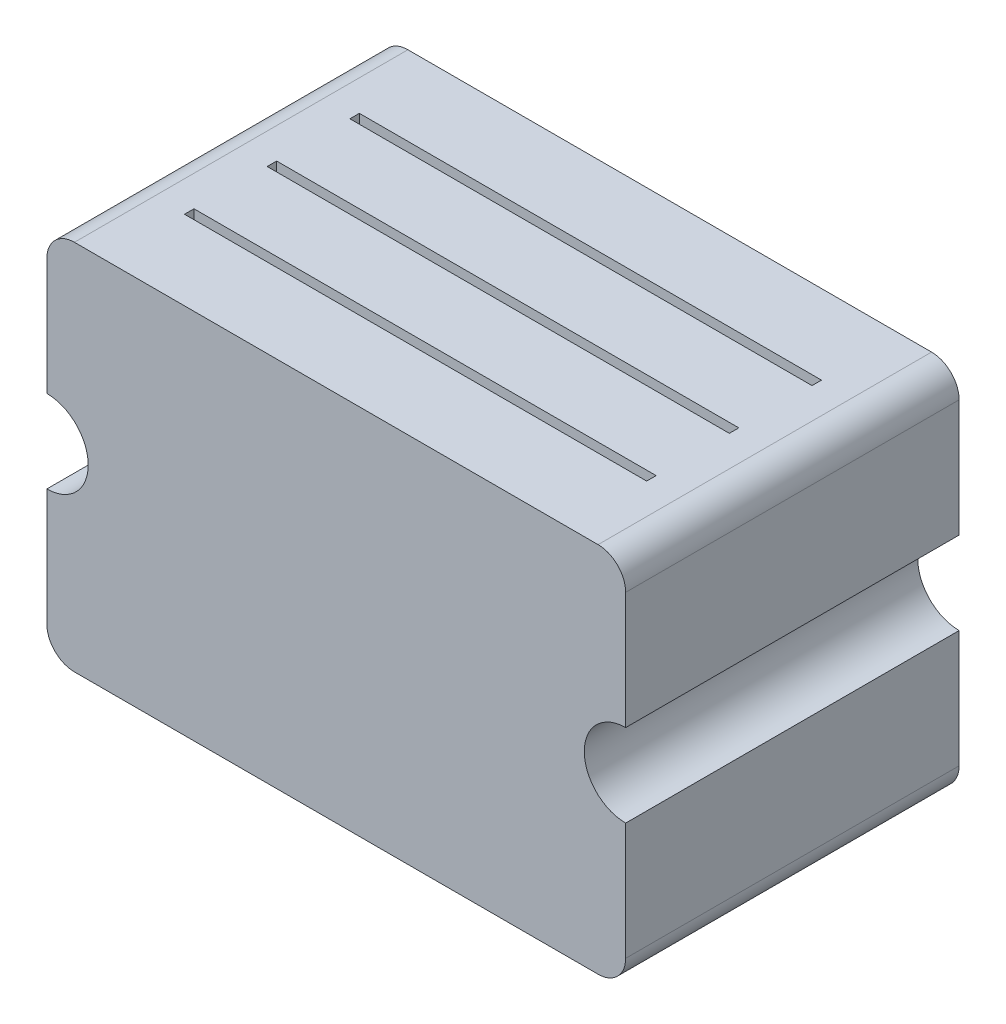
ISO-10303-21;
HEADER;
FILE_DESCRIPTION(('STEP AP214'),'2;1');
FILE_NAME('part.step','',(''),(''),'','','');
FILE_SCHEMA(('AUTOMOTIVE_DESIGN { 1 0 10303 214 1 1 1 1 }'));
ENDSEC;
DATA;
#1=APPLICATION_CONTEXT('core data for automotive mechanical design processes');
#2=APPLICATION_PROTOCOL_DEFINITION('international standard','automotive_design',2000,#1);
#3=PRODUCT_CONTEXT('',#1,'mechanical');
#4=PRODUCT('Part','Part','',(#3));
#5=PRODUCT_RELATED_PRODUCT_CATEGORY('part','',(#4));
#6=PRODUCT_DEFINITION_FORMATION('','',#4);
#7=PRODUCT_DEFINITION_CONTEXT('part definition',#1,'design');
#8=PRODUCT_DEFINITION('design','',#6,#7);
#9=PRODUCT_DEFINITION_SHAPE('','',#8);
#10=(LENGTH_UNIT() NAMED_UNIT(*) SI_UNIT(.MILLI.,.METRE.));
#11=(NAMED_UNIT(*) PLANE_ANGLE_UNIT() SI_UNIT($,.RADIAN.));
#12=(NAMED_UNIT(*) SI_UNIT($,.STERADIAN.) SOLID_ANGLE_UNIT());
#13=UNCERTAINTY_MEASURE_WITH_UNIT(LENGTH_MEASURE(1.E-05),#10,'distance_accuracy_value','');
#14=(GEOMETRIC_REPRESENTATION_CONTEXT(3) GLOBAL_UNCERTAINTY_ASSIGNED_CONTEXT((#13)) GLOBAL_UNIT_ASSIGNED_CONTEXT((#10,
#11,#12)) REPRESENTATION_CONTEXT('',''));
#15=CARTESIAN_POINT('',(0.,0.,0.));
#16=DIRECTION('',(0.,0.,1.));
#17=DIRECTION('',(1.,0.,0.));
#18=AXIS2_PLACEMENT_3D('',#15,#16,#17);
#19=CARTESIAN_POINT('',(-1.05,-0.675,0.));
#20=DIRECTION('',(0.,-1.,0.));
#21=DIRECTION('',(0.,0.,-1.));
#22=AXIS2_PLACEMENT_3D('',#19,#20,#21);
#23=PLANE('',#22);
#24=DIRECTION('',(0.,0.,-1.));
#25=VECTOR('',#24,1.);
#26=CARTESIAN_POINT('',(0.838391795984,-0.675,0.471094755903));
#27=LINE('',#26,#25);
#28=CARTESIAN_POINT('',(0.838391795984,-0.675,0.942189511805));
#29=VERTEX_POINT('',#28);
#30=CARTESIAN_POINT('',(0.838391795984,-0.675,0.907810488195));
#31=VERTEX_POINT('',#30);
#32=EDGE_CURVE('E438',#29,#31,#27,.T.);
#33=ORIENTED_EDGE('',*,*,#32,.T.);
#34=DIRECTION('',(-1.,0.,0.));
#35=VECTOR('',#34,1.);
#36=CARTESIAN_POINT('',(-0.105804102008,-0.675,0.907810488195));
#37=LINE('',#36,#35);
#38=CARTESIAN_POINT('',(-0.838391795984,-0.675,0.907810488195));
#39=VERTEX_POINT('',#38);
#40=EDGE_CURVE('E483',#31,#39,#37,.T.);
#41=ORIENTED_EDGE('',*,*,#40,.T.);
#42=DIRECTION('',(0.,0.,1.));
#43=VECTOR('',#42,1.);
#44=CARTESIAN_POINT('',(-0.838391795984,-0.675,0.453905244097));
#45=LINE('',#44,#43);
#46=CARTESIAN_POINT('',(-0.838391795984,-0.675,0.942189511805));
#47=VERTEX_POINT('',#46);
#48=EDGE_CURVE('E477',#39,#47,#45,.T.);
#49=ORIENTED_EDGE('',*,*,#48,.T.);
#50=DIRECTION('',(1.,0.,0.));
#51=VECTOR('',#50,1.);
#52=CARTESIAN_POINT('',(-0.944195897992,-0.675,0.942189511805));
#53=LINE('',#52,#51);
#54=EDGE_CURVE('E47',#47,#29,#53,.T.);
#55=ORIENTED_EDGE('',*,*,#54,.T.);
#56=EDGE_LOOP('',(#33,#41,#49,#55));
#57=FACE_BOUND('',#56,.T.);
#58=DIRECTION('',(0.,0.,-1.));
#59=VECTOR('',#58,1.);
#60=CARTESIAN_POINT('',(0.838391795984,-0.675,0.321094755903));
#61=LINE('',#60,#59);
#62=CARTESIAN_POINT('',(0.838391795984,-0.675,0.642189511805));
#63=VERTEX_POINT('',#62);
#64=CARTESIAN_POINT('',(0.838391795984,-0.675,0.607810488195));
#65=VERTEX_POINT('',#64);
#66=EDGE_CURVE('E415',#63,#65,#61,.T.);
#67=ORIENTED_EDGE('',*,*,#66,.T.);
#68=DIRECTION('',(-1.,0.,0.));
#69=VECTOR('',#68,1.);
#70=CARTESIAN_POINT('',(-0.105804102008,-0.675,0.607810488195));
#71=LINE('',#70,#69);
#72=CARTESIAN_POINT('',(-0.838391795984,-0.675,0.607810488195));
#73=VERTEX_POINT('',#72);
#74=EDGE_CURVE('E416',#65,#73,#71,.T.);
#75=ORIENTED_EDGE('',*,*,#74,.T.);
#76=DIRECTION('',(0.,0.,1.));
#77=VECTOR('',#76,1.);
#78=CARTESIAN_POINT('',(-0.838391795984,-0.675,0.303905244097));
#79=LINE('',#78,#77);
#80=CARTESIAN_POINT('',(-0.838391795984,-0.675,0.642189511805));
#81=VERTEX_POINT('',#80);
#82=EDGE_CURVE('E369',#73,#81,#79,.T.);
#83=ORIENTED_EDGE('',*,*,#82,.T.);
#84=DIRECTION('',(1.,0.,0.));
#85=VECTOR('',#84,1.);
#86=CARTESIAN_POINT('',(-0.944195897992,-0.675,0.642189511805));
#87=LINE('',#86,#85);
#88=EDGE_CURVE('E470',#81,#63,#87,.T.);
#89=ORIENTED_EDGE('',*,*,#88,.T.);
#90=EDGE_LOOP('',(#67,#75,#83,#89));
#91=FACE_BOUND('',#90,.T.);
#92=DIRECTION('',(0.,0.,-1.));
#93=VECTOR('',#92,1.);
#94=CARTESIAN_POINT('',(0.838391795984,-0.675,0.171094755903));
#95=LINE('',#94,#93);
#96=CARTESIAN_POINT('',(0.838391795984,-0.675,0.342189511805));
#97=VERTEX_POINT('',#96);
#98=CARTESIAN_POINT('',(0.838391795984,-0.675,0.307810488195));
#99=VERTEX_POINT('',#98);
#100=EDGE_CURVE('E273',#97,#99,#95,.T.);
#101=ORIENTED_EDGE('',*,*,#100,.T.);
#102=DIRECTION('',(-1.,0.,0.));
#103=VECTOR('',#102,1.);
#104=CARTESIAN_POINT('',(-0.105804102008,-0.675,0.307810488195));
#105=LINE('',#104,#103);
#106=CARTESIAN_POINT('',(-0.838391795984,-0.675,0.307810488195));
#107=VERTEX_POINT('',#106);
#108=EDGE_CURVE('E337',#99,#107,#105,.T.);
#109=ORIENTED_EDGE('',*,*,#108,.T.);
#110=DIRECTION('',(0.,0.,1.));
#111=VECTOR('',#110,1.);
#112=CARTESIAN_POINT('',(-0.838391795984,-0.675,0.153905244097));
#113=LINE('',#112,#111);
#114=CARTESIAN_POINT('',(-0.838391795984,-0.675,0.342189511805));
#115=VERTEX_POINT('',#114);
#116=EDGE_CURVE('E447',#107,#115,#113,.T.);
#117=ORIENTED_EDGE('',*,*,#116,.T.);
#118=DIRECTION('',(1.,0.,0.));
#119=VECTOR('',#118,1.);
#120=CARTESIAN_POINT('',(-0.944195897992,-0.675,0.342189511805));
#121=LINE('',#120,#119);
#122=EDGE_CURVE('E272',#115,#97,#121,.T.);
#123=ORIENTED_EDGE('',*,*,#122,.T.);
#124=EDGE_LOOP('',(#101,#109,#117,#123));
#125=FACE_BOUND('',#124,.T.);
#126=DIRECTION('',(0.,0.,1.));
#127=VECTOR('',#126,1.);
#128=CARTESIAN_POINT('',(-0.95,-0.675,0.));
#129=LINE('',#128,#127);
#130=CARTESIAN_POINT('',(-0.95,-0.675,0.02));
#131=VERTEX_POINT('',#130);
#132=CARTESIAN_POINT('',(-0.95,-0.675,1.23));
#133=VERTEX_POINT('',#132);
#134=EDGE_CURVE('E399',#131,#133,#129,.T.);
#135=ORIENTED_EDGE('',*,*,#134,.F.);
#136=DIRECTION('',(-1.,0.,0.));
#137=VECTOR('',#136,1.);
#138=CARTESIAN_POINT('',(0.,-0.675,0.02));
#139=LINE('',#138,#137);
#140=CARTESIAN_POINT('',(0.95,-0.675,0.02));
#141=VERTEX_POINT('',#140);
#142=EDGE_CURVE('E11',#141,#131,#139,.T.);
#143=ORIENTED_EDGE('',*,*,#142,.F.);
#144=DIRECTION('',(0.,0.,-1.));
#145=VECTOR('',#144,1.);
#146=CARTESIAN_POINT('',(0.95,-0.675,0.));
#147=LINE('',#146,#145);
#148=CARTESIAN_POINT('',(0.95,-0.675,1.23));
#149=VERTEX_POINT('',#148);
#150=EDGE_CURVE('E365',#149,#141,#147,.T.);
#151=ORIENTED_EDGE('',*,*,#150,.F.);
#152=DIRECTION('',(1.,0.,0.));
#153=VECTOR('',#152,1.);
#154=CARTESIAN_POINT('',(-1.05,-0.675,1.23));
#155=LINE('',#154,#153);
#156=EDGE_CURVE('E360',#133,#149,#155,.T.);
#157=ORIENTED_EDGE('',*,*,#156,.F.);
#158=EDGE_LOOP('',(#135,#143,#151,#157));
#159=FACE_BOUND('',#158,.T.);
#160=ADVANCED_FACE('F17',(#57,#91,#125,#159),#23,.T.);
#161=CARTESIAN_POINT('',(0.,0.,0.02));
#162=DIRECTION('',(0.,0.,1.));
#163=DIRECTION('',(1.,0.,0.));
#164=AXIS2_PLACEMENT_3D('',#161,#162,#163);
#165=PLANE('',#164);
#166=CARTESIAN_POINT('',(-0.95,0.575,0.02));
#167=DIRECTION('',(0.,0.,1.));
#168=DIRECTION('',(-0.707106781186548,0.707106781186548,0.));
#169=AXIS2_PLACEMENT_3D('',#166,#167,#168);
#170=CIRCLE('',#169,0.1);
#171=CARTESIAN_POINT('',(-0.95,0.675,0.02));
#172=VERTEX_POINT('',#171);
#173=CARTESIAN_POINT('',(-1.05,0.575,0.02));
#174=VERTEX_POINT('',#173);
#175=EDGE_CURVE('E250',#172,#174,#170,.T.);
#176=ORIENTED_EDGE('',*,*,#175,.F.);
#177=DIRECTION('',(1.,0.,0.));
#178=VECTOR('',#177,1.);
#179=CARTESIAN_POINT('',(1.05,0.675,0.02));
#180=LINE('',#179,#178);
#181=CARTESIAN_POINT('',(0.95,0.675,0.02));
#182=VERTEX_POINT('',#181);
#183=EDGE_CURVE('E308',#172,#182,#180,.T.);
#184=ORIENTED_EDGE('',*,*,#183,.T.);
#185=CARTESIAN_POINT('',(0.95,0.575,0.02));
#186=DIRECTION('',(0.,0.,1.));
#187=DIRECTION('',(0.707106781186548,0.707106781186548,0.));
#188=AXIS2_PLACEMENT_3D('',#185,#186,#187);
#189=CIRCLE('',#188,0.1);
#190=CARTESIAN_POINT('',(1.05,0.575,0.02));
#191=VERTEX_POINT('',#190);
#192=EDGE_CURVE('E314',#191,#182,#189,.T.);
#193=ORIENTED_EDGE('',*,*,#192,.F.);
#194=DIRECTION('',(0.,-1.,0.));
#195=VECTOR('',#194,1.);
#196=CARTESIAN_POINT('',(1.05,0.,0.02));
#197=LINE('',#196,#195);
#198=CARTESIAN_POINT('',(1.05,0.15,0.02));
#199=VERTEX_POINT('',#198);
#200=EDGE_CURVE('E313',#191,#199,#197,.T.);
#201=ORIENTED_EDGE('',*,*,#200,.T.);
#202=CARTESIAN_POINT('',(1.05,0.,0.02));
#203=DIRECTION('',(0.,0.,1.));
#204=DIRECTION('',(-1.,0.,0.));
#205=AXIS2_PLACEMENT_3D('',#202,#203,#204);
#206=CIRCLE('',#205,0.15);
#207=CARTESIAN_POINT('',(1.05,-0.15,0.02));
#208=VERTEX_POINT('',#207);
#209=EDGE_CURVE('E410',#199,#208,#206,.T.);
#210=ORIENTED_EDGE('',*,*,#209,.T.);
#211=DIRECTION('',(0.,-1.,0.));
#212=VECTOR('',#211,1.);
#213=CARTESIAN_POINT('',(1.05,0.,0.02));
#214=LINE('',#213,#212);
#215=CARTESIAN_POINT('',(1.05,-0.575,0.02));
#216=VERTEX_POINT('',#215);
#217=EDGE_CURVE('E349',#208,#216,#214,.T.);
#218=ORIENTED_EDGE('',*,*,#217,.T.);
#219=CARTESIAN_POINT('',(0.95,-0.575,0.02));
#220=DIRECTION('',(0.,0.,1.));
#221=DIRECTION('',(0.707106781186548,-0.707106781186548,0.));
#222=AXIS2_PLACEMENT_3D('',#219,#220,#221);
#223=CIRCLE('',#222,0.1);
#224=EDGE_CURVE('E361',#141,#216,#223,.T.);
#225=ORIENTED_EDGE('',*,*,#224,.F.);
#226=ORIENTED_EDGE('',*,*,#142,.T.);
#227=CARTESIAN_POINT('',(-0.95,-0.575,0.02));
#228=DIRECTION('',(0.,0.,1.));
#229=DIRECTION('',(-0.707106781186548,-0.707106781186548,0.));
#230=AXIS2_PLACEMENT_3D('',#227,#228,#229);
#231=CIRCLE('',#230,0.1);
#232=CARTESIAN_POINT('',(-1.05,-0.575,0.02));
#233=VERTEX_POINT('',#232);
#234=EDGE_CURVE('E395',#233,#131,#231,.T.);
#235=ORIENTED_EDGE('',*,*,#234,.F.);
#236=DIRECTION('',(0.,1.,0.));
#237=VECTOR('',#236,1.);
#238=CARTESIAN_POINT('',(-1.05,0.675,0.02));
#239=LINE('',#238,#237);
#240=CARTESIAN_POINT('',(-1.05,-0.15,0.02));
#241=VERTEX_POINT('',#240);
#242=EDGE_CURVE('E406',#233,#241,#239,.T.);
#243=ORIENTED_EDGE('',*,*,#242,.T.);
#244=CARTESIAN_POINT('',(-1.05,0.,0.02));
#245=DIRECTION('',(0.,0.,1.));
#246=DIRECTION('',(-1.,0.,0.));
#247=AXIS2_PLACEMENT_3D('',#244,#245,#246);
#248=CIRCLE('',#247,0.15);
#249=CARTESIAN_POINT('',(-1.05,0.15,0.02));
#250=VERTEX_POINT('',#249);
#251=EDGE_CURVE('E409',#241,#250,#248,.T.);
#252=ORIENTED_EDGE('',*,*,#251,.T.);
#253=DIRECTION('',(0.,1.,0.));
#254=VECTOR('',#253,1.);
#255=CARTESIAN_POINT('',(-1.05,0.675,0.02));
#256=LINE('',#255,#254);
#257=EDGE_CURVE('E20',#250,#174,#256,.T.);
#258=ORIENTED_EDGE('',*,*,#257,.T.);
#259=EDGE_LOOP('',(#176,#184,#193,#201,#210,#218,#225,#226,#235,#243,#252,#258));
#260=FACE_BOUND('',#259,.T.);
#261=ADVANCED_FACE('F497',(#260),#165,.F.);
#262=CARTESIAN_POINT('',(-1.05,0.675,0.));
#263=DIRECTION('',(-1.,0.,0.));
#264=DIRECTION('',(0.,0.,1.));
#265=AXIS2_PLACEMENT_3D('',#262,#263,#264);
#266=PLANE('',#265);
#267=DIRECTION('',(0.,0.,1.));
#268=VECTOR('',#267,1.);
#269=CARTESIAN_POINT('',(-1.05,0.575,0.));
#270=LINE('',#269,#268);
#271=CARTESIAN_POINT('',(-1.05,0.575,1.23));
#272=VERTEX_POINT('',#271);
#273=EDGE_CURVE('E232',#174,#272,#270,.T.);
#274=ORIENTED_EDGE('',*,*,#273,.F.);
#275=ORIENTED_EDGE('',*,*,#257,.F.);
#276=DIRECTION('',(0.,0.,1.));
#277=VECTOR('',#276,1.);
#278=CARTESIAN_POINT('',(-1.05,0.15,1.23));
#279=LINE('',#278,#277);
#280=CARTESIAN_POINT('',(-1.05,0.15,1.23));
#281=VERTEX_POINT('',#280);
#282=EDGE_CURVE('E235',#250,#281,#279,.T.);
#283=ORIENTED_EDGE('',*,*,#282,.T.);
#284=DIRECTION('',(0.,-1.,0.));
#285=VECTOR('',#284,1.);
#286=CARTESIAN_POINT('',(-1.05,0.675,1.23));
#287=LINE('',#286,#285);
#288=EDGE_CURVE('E229',#272,#281,#287,.T.);
#289=ORIENTED_EDGE('',*,*,#288,.F.);
#290=EDGE_LOOP('',(#274,#275,#283,#289));
#291=FACE_BOUND('',#290,.T.);
#292=ADVANCED_FACE('F231',(#291),#266,.T.);
#293=CARTESIAN_POINT('',(-1.05,0.,1.23));
#294=DIRECTION('',(0.,0.,1.));
#295=DIRECTION('',(-1.,0.,0.));
#296=AXIS2_PLACEMENT_3D('',#293,#294,#295);
#297=CYLINDRICAL_SURFACE('',#296,0.15);
#298=ORIENTED_EDGE('',*,*,#282,.F.);
#299=ORIENTED_EDGE('',*,*,#251,.F.);
#300=DIRECTION('',(0.,0.,-1.));
#301=VECTOR('',#300,1.);
#302=CARTESIAN_POINT('',(-1.05,-0.15,1.23));
#303=LINE('',#302,#301);
#304=CARTESIAN_POINT('',(-1.05,-0.15,1.23));
#305=VERTEX_POINT('',#304);
#306=EDGE_CURVE('E402',#305,#241,#303,.T.);
#307=ORIENTED_EDGE('',*,*,#306,.F.);
#308=CARTESIAN_POINT('',(-1.05,0.,1.23));
#309=DIRECTION('',(0.,0.,-1.));
#310=DIRECTION('',(-1.,0.,0.));
#311=AXIS2_PLACEMENT_3D('',#308,#309,#310);
#312=CIRCLE('',#311,0.15);
#313=EDGE_CURVE('E241',#281,#305,#312,.T.);
#314=ORIENTED_EDGE('',*,*,#313,.F.);
#315=EDGE_LOOP('',(#298,#299,#307,#314));
#316=FACE_BOUND('',#315,.T.);
#317=ADVANCED_FACE('F595',(#316),#297,.F.);
#318=CARTESIAN_POINT('',(1.05,0.,1.23));
#319=DIRECTION('',(0.,0.,1.));
#320=DIRECTION('',(-1.,0.,0.));
#321=AXIS2_PLACEMENT_3D('',#318,#319,#320);
#322=CYLINDRICAL_SURFACE('',#321,0.15);
#323=DIRECTION('',(0.,0.,-1.));
#324=VECTOR('',#323,1.);
#325=CARTESIAN_POINT('',(1.05,0.15,1.23));
#326=LINE('',#325,#324);
#327=CARTESIAN_POINT('',(1.05,0.15,1.23));
#328=VERTEX_POINT('',#327);
#329=EDGE_CURVE('E309',#328,#199,#326,.T.);
#330=ORIENTED_EDGE('',*,*,#329,.F.);
#331=CARTESIAN_POINT('',(1.05,0.,1.23));
#332=DIRECTION('',(0.,0.,-1.));
#333=DIRECTION('',(-1.,0.,0.));
#334=AXIS2_PLACEMENT_3D('',#331,#332,#333);
#335=CIRCLE('',#334,0.15);
#336=CARTESIAN_POINT('',(1.05,-0.15,1.23));
#337=VERTEX_POINT('',#336);
#338=EDGE_CURVE('E379',#337,#328,#335,.T.);
#339=ORIENTED_EDGE('',*,*,#338,.F.);
#340=DIRECTION('',(0.,0.,1.));
#341=VECTOR('',#340,1.);
#342=CARTESIAN_POINT('',(1.05,-0.15,1.23));
#343=LINE('',#342,#341);
#344=EDGE_CURVE('E345',#208,#337,#343,.T.);
#345=ORIENTED_EDGE('',*,*,#344,.F.);
#346=ORIENTED_EDGE('',*,*,#209,.F.);
#347=EDGE_LOOP('',(#330,#339,#345,#346));
#348=FACE_BOUND('',#347,.T.);
#349=ADVANCED_FACE('F592',(#348),#322,.F.);
#350=CARTESIAN_POINT('',(-0.838391795984,0.675,0.942189511805));
#351=DIRECTION('',(0.,0.,1.));
#352=DIRECTION('',(1.,0.,0.));
#353=AXIS2_PLACEMENT_3D('',#350,#351,#352);
#354=PLANE('',#353);
#355=DIRECTION('',(-1.,0.,0.));
#356=VECTOR('',#355,1.);
#357=CARTESIAN_POINT('',(0.105804102008,0.675,0.942189511805));
#358=LINE('',#357,#356);
#359=CARTESIAN_POINT('',(0.838391795984,0.675,0.942189511805));
#360=VERTEX_POINT('',#359);
#361=CARTESIAN_POINT('',(-0.838391795984,0.675,0.942189511805));
#362=VERTEX_POINT('',#361);
#363=EDGE_CURVE('E287',#360,#362,#358,.T.);
#364=ORIENTED_EDGE('',*,*,#363,.F.);
#365=DIRECTION('',(0.,-1.,0.));
#366=VECTOR('',#365,1.);
#367=CARTESIAN_POINT('',(0.838391795984,0.675,0.942189511805));
#368=LINE('',#367,#366);
#369=EDGE_CURVE('E431',#360,#29,#368,.T.);
#370=ORIENTED_EDGE('',*,*,#369,.T.);
#371=ORIENTED_EDGE('',*,*,#54,.F.);
#372=DIRECTION('',(0.,-1.,0.));
#373=VECTOR('',#372,1.);
#374=CARTESIAN_POINT('',(-0.838391795984,0.675,0.942189511805));
#375=LINE('',#374,#373);
#376=EDGE_CURVE('E473',#362,#47,#375,.T.);
#377=ORIENTED_EDGE('',*,*,#376,.F.);
#378=EDGE_LOOP('',(#364,#370,#371,#377));
#379=FACE_BOUND('',#378,.T.);
#380=ADVANCED_FACE('F573',(#379),#354,.F.);
#381=CARTESIAN_POINT('',(0.838391795984,0.675,0.942189511805));
#382=DIRECTION('',(1.,0.,0.));
#383=DIRECTION('',(0.,1.,0.));
#384=AXIS2_PLACEMENT_3D('',#381,#382,#383);
#385=PLANE('',#384);
#386=DIRECTION('',(0.,0.,1.));
#387=VECTOR('',#386,1.);
#388=CARTESIAN_POINT('',(0.838391795984,0.675,0.471094755903));
#389=LINE('',#388,#387);
#390=CARTESIAN_POINT('',(0.838391795984,0.675,0.907810488195));
#391=VERTEX_POINT('',#390);
#392=EDGE_CURVE('E297',#391,#360,#389,.T.);
#393=ORIENTED_EDGE('',*,*,#392,.F.);
#394=DIRECTION('',(0.,-1.,0.));
#395=VECTOR('',#394,1.);
#396=CARTESIAN_POINT('',(0.838391795984,0.675,0.907810488195));
#397=LINE('',#396,#395);
#398=EDGE_CURVE('E441',#391,#31,#397,.T.);
#399=ORIENTED_EDGE('',*,*,#398,.T.);
#400=ORIENTED_EDGE('',*,*,#32,.F.);
#401=ORIENTED_EDGE('',*,*,#369,.F.);
#402=EDGE_LOOP('',(#393,#399,#400,#401));
#403=FACE_BOUND('',#402,.T.);
#404=ADVANCED_FACE('F570',(#403),#385,.F.);
#405=CARTESIAN_POINT('',(0.838391795984,0.675,0.907810488195));
#406=DIRECTION('',(0.,0.,-1.));
#407=DIRECTION('',(0.,-1.,0.));
#408=AXIS2_PLACEMENT_3D('',#405,#406,#407);
#409=PLANE('',#408);
#410=DIRECTION('',(1.,0.,0.));
#411=VECTOR('',#410,1.);
#412=CARTESIAN_POINT('',(0.944195897992,0.675,0.907810488195));
#413=LINE('',#412,#411);
#414=CARTESIAN_POINT('',(-0.838391795984,0.675,0.907810488195));
#415=VERTEX_POINT('',#414);
#416=EDGE_CURVE('E280',#415,#391,#413,.T.);
#417=ORIENTED_EDGE('',*,*,#416,.F.);
#418=DIRECTION('',(0.,1.,0.));
#419=VECTOR('',#418,1.);
#420=CARTESIAN_POINT('',(-0.838391795984,0.675,0.907810488195));
#421=LINE('',#420,#419);
#422=EDGE_CURVE('E480',#39,#415,#421,.T.);
#423=ORIENTED_EDGE('',*,*,#422,.F.);
#424=ORIENTED_EDGE('',*,*,#40,.F.);
#425=ORIENTED_EDGE('',*,*,#398,.F.);
#426=EDGE_LOOP('',(#417,#423,#424,#425));
#427=FACE_BOUND('',#426,.T.);
#428=ADVANCED_FACE('F580',(#427),#409,.F.);
#429=CARTESIAN_POINT('',(-0.838391795984,0.675,0.907810488195));
#430=DIRECTION('',(-1.,0.,0.));
#431=DIRECTION('',(0.,0.,1.));
#432=AXIS2_PLACEMENT_3D('',#429,#430,#431);
#433=PLANE('',#432);
#434=DIRECTION('',(0.,0.,-1.));
#435=VECTOR('',#434,1.);
#436=CARTESIAN_POINT('',(-0.838391795984,0.675,0.453905244097));
#437=LINE('',#436,#435);
#438=EDGE_CURVE('E283',#362,#415,#437,.T.);
#439=ORIENTED_EDGE('',*,*,#438,.F.);
#440=ORIENTED_EDGE('',*,*,#376,.T.);
#441=ORIENTED_EDGE('',*,*,#48,.F.);
#442=ORIENTED_EDGE('',*,*,#422,.T.);
#443=EDGE_LOOP('',(#439,#440,#441,#442));
#444=FACE_BOUND('',#443,.T.);
#445=ADVANCED_FACE('F577',(#444),#433,.F.);
#446=CARTESIAN_POINT('',(-0.838391795984,0.675,0.642189511805));
#447=DIRECTION('',(0.,0.,1.));
#448=DIRECTION('',(1.,0.,0.));
#449=AXIS2_PLACEMENT_3D('',#446,#447,#448);
#450=PLANE('',#449);
#451=DIRECTION('',(-1.,0.,0.));
#452=VECTOR('',#451,1.);
#453=CARTESIAN_POINT('',(0.105804102008,0.675,0.642189511805));
#454=LINE('',#453,#452);
#455=CARTESIAN_POINT('',(0.838391795984,0.675,0.642189511805));
#456=VERTEX_POINT('',#455);
#457=CARTESIAN_POINT('',(-0.838391795984,0.675,0.642189511805));
#458=VERTEX_POINT('',#457);
#459=EDGE_CURVE('E279',#456,#458,#454,.T.);
#460=ORIENTED_EDGE('',*,*,#459,.F.);
#461=DIRECTION('',(0.,-1.,0.));
#462=VECTOR('',#461,1.);
#463=CARTESIAN_POINT('',(0.838391795984,0.675,0.642189511805));
#464=LINE('',#463,#462);
#465=EDGE_CURVE('E434',#456,#63,#464,.T.);
#466=ORIENTED_EDGE('',*,*,#465,.T.);
#467=ORIENTED_EDGE('',*,*,#88,.F.);
#468=DIRECTION('',(0.,-1.,0.));
#469=VECTOR('',#468,1.);
#470=CARTESIAN_POINT('',(-0.838391795984,0.675,0.642189511805));
#471=LINE('',#470,#469);
#472=EDGE_CURVE('E374',#458,#81,#471,.T.);
#473=ORIENTED_EDGE('',*,*,#472,.F.);
#474=EDGE_LOOP('',(#460,#466,#467,#473));
#475=FACE_BOUND('',#474,.T.);
#476=ADVANCED_FACE('F562',(#475),#450,.F.);
#477=CARTESIAN_POINT('',(0.838391795984,0.675,0.642189511805));
#478=DIRECTION('',(1.,0.,0.));
#479=DIRECTION('',(0.,1.,0.));
#480=AXIS2_PLACEMENT_3D('',#477,#478,#479);
#481=PLANE('',#480);
#482=DIRECTION('',(0.,0.,1.));
#483=VECTOR('',#482,1.);
#484=CARTESIAN_POINT('',(0.838391795984,0.675,0.321094755903));
#485=LINE('',#484,#483);
#486=CARTESIAN_POINT('',(0.838391795984,0.675,0.607810488195));
#487=VERTEX_POINT('',#486);
#488=EDGE_CURVE('E275',#487,#456,#485,.T.);
#489=ORIENTED_EDGE('',*,*,#488,.F.);
#490=DIRECTION('',(0.,-1.,0.));
#491=VECTOR('',#490,1.);
#492=CARTESIAN_POINT('',(0.838391795984,0.675,0.607810488195));
#493=LINE('',#492,#491);
#494=EDGE_CURVE('E411',#487,#65,#493,.T.);
#495=ORIENTED_EDGE('',*,*,#494,.T.);
#496=ORIENTED_EDGE('',*,*,#66,.F.);
#497=ORIENTED_EDGE('',*,*,#465,.F.);
#498=EDGE_LOOP('',(#489,#495,#496,#497));
#499=FACE_BOUND('',#498,.T.);
#500=ADVANCED_FACE('F553',(#499),#481,.F.);
#501=CARTESIAN_POINT('',(0.838391795984,0.675,0.607810488195));
#502=DIRECTION('',(0.,0.,-1.));
#503=DIRECTION('',(0.,-1.,0.));
#504=AXIS2_PLACEMENT_3D('',#501,#502,#503);
#505=PLANE('',#504);
#506=DIRECTION('',(1.,0.,0.));
#507=VECTOR('',#506,1.);
#508=CARTESIAN_POINT('',(0.944195897992,0.675,0.607810488195));
#509=LINE('',#508,#507);
#510=CARTESIAN_POINT('',(-0.838391795984,0.675,0.607810488195));
#511=VERTEX_POINT('',#510);
#512=EDGE_CURVE('E293',#511,#487,#509,.T.);
#513=ORIENTED_EDGE('',*,*,#512,.F.);
#514=DIRECTION('',(0.,1.,0.));
#515=VECTOR('',#514,1.);
#516=CARTESIAN_POINT('',(-0.838391795984,0.675,0.607810488195));
#517=LINE('',#516,#515);
#518=EDGE_CURVE('E373',#73,#511,#517,.T.);
#519=ORIENTED_EDGE('',*,*,#518,.F.);
#520=ORIENTED_EDGE('',*,*,#74,.F.);
#521=ORIENTED_EDGE('',*,*,#494,.F.);
#522=EDGE_LOOP('',(#513,#519,#520,#521));
#523=FACE_BOUND('',#522,.T.);
#524=ADVANCED_FACE('F556',(#523),#505,.F.);
#525=CARTESIAN_POINT('',(-0.838391795984,0.675,0.607810488195));
#526=DIRECTION('',(-1.,0.,0.));
#527=DIRECTION('',(0.,0.,1.));
#528=AXIS2_PLACEMENT_3D('',#525,#526,#527);
#529=PLANE('',#528);
#530=DIRECTION('',(0.,0.,-1.));
#531=VECTOR('',#530,1.);
#532=CARTESIAN_POINT('',(-0.838391795984,0.675,0.303905244097));
#533=LINE('',#532,#531);
#534=EDGE_CURVE('E301',#458,#511,#533,.T.);
#535=ORIENTED_EDGE('',*,*,#534,.F.);
#536=ORIENTED_EDGE('',*,*,#472,.T.);
#537=ORIENTED_EDGE('',*,*,#82,.F.);
#538=ORIENTED_EDGE('',*,*,#518,.T.);
#539=EDGE_LOOP('',(#535,#536,#537,#538));
#540=FACE_BOUND('',#539,.T.);
#541=ADVANCED_FACE('F538',(#540),#529,.F.);
#542=CARTESIAN_POINT('',(-0.838391795984,0.675,0.342189511805));
#543=DIRECTION('',(0.,0.,1.));
#544=DIRECTION('',(1.,0.,0.));
#545=AXIS2_PLACEMENT_3D('',#542,#543,#544);
#546=PLANE('',#545);
#547=DIRECTION('',(-1.,0.,0.));
#548=VECTOR('',#547,1.);
#549=CARTESIAN_POINT('',(0.105804102008,0.675,0.342189511805));
#550=LINE('',#549,#548);
#551=CARTESIAN_POINT('',(0.838391795984,0.675,0.342189511805));
#552=VERTEX_POINT('',#551);
#553=CARTESIAN_POINT('',(-0.838391795984,0.675,0.342189511805));
#554=VERTEX_POINT('',#553);
#555=EDGE_CURVE('E292',#552,#554,#550,.T.);
#556=ORIENTED_EDGE('',*,*,#555,.F.);
#557=DIRECTION('',(0.,-1.,0.));
#558=VECTOR('',#557,1.);
#559=CARTESIAN_POINT('',(0.838391795984,0.675,0.342189511805));
#560=LINE('',#559,#558);
#561=EDGE_CURVE('E269',#552,#97,#560,.T.);
#562=ORIENTED_EDGE('',*,*,#561,.T.);
#563=ORIENTED_EDGE('',*,*,#122,.F.);
#564=DIRECTION('',(0.,-1.,0.));
#565=VECTOR('',#564,1.);
#566=CARTESIAN_POINT('',(-0.838391795984,0.675,0.342189511805));
#567=LINE('',#566,#565);
#568=EDGE_CURVE('E348',#554,#115,#567,.T.);
#569=ORIENTED_EDGE('',*,*,#568,.F.);
#570=EDGE_LOOP('',(#556,#562,#563,#569));
#571=FACE_BOUND('',#570,.T.);
#572=ADVANCED_FACE('F524',(#571),#546,.F.);
#573=CARTESIAN_POINT('',(0.838391795984,0.675,0.342189511805));
#574=DIRECTION('',(1.,0.,0.));
#575=DIRECTION('',(0.,1.,0.));
#576=AXIS2_PLACEMENT_3D('',#573,#574,#575);
#577=PLANE('',#576);
#578=DIRECTION('',(0.,0.,1.));
#579=VECTOR('',#578,1.);
#580=CARTESIAN_POINT('',(0.838391795984,0.675,0.171094755903));
#581=LINE('',#580,#579);
#582=CARTESIAN_POINT('',(0.838391795984,0.675,0.307810488195));
#583=VERTEX_POINT('',#582);
#584=EDGE_CURVE('E288',#583,#552,#581,.T.);
#585=ORIENTED_EDGE('',*,*,#584,.F.);
#586=DIRECTION('',(0.,-1.,0.));
#587=VECTOR('',#586,1.);
#588=CARTESIAN_POINT('',(0.838391795984,0.675,0.307810488195));
#589=LINE('',#588,#587);
#590=EDGE_CURVE('E340',#583,#99,#589,.T.);
#591=ORIENTED_EDGE('',*,*,#590,.T.);
#592=ORIENTED_EDGE('',*,*,#100,.F.);
#593=ORIENTED_EDGE('',*,*,#561,.F.);
#594=EDGE_LOOP('',(#585,#591,#592,#593));
#595=FACE_BOUND('',#594,.T.);
#596=ADVANCED_FACE('F529',(#595),#577,.F.);
#597=CARTESIAN_POINT('',(0.838391795984,0.675,0.307810488195));
#598=DIRECTION('',(0.,0.,-1.));
#599=DIRECTION('',(0.,-1.,0.));
#600=AXIS2_PLACEMENT_3D('',#597,#598,#599);
#601=PLANE('',#600);
#602=DIRECTION('',(1.,0.,0.));
#603=VECTOR('',#602,1.);
#604=CARTESIAN_POINT('',(0.944195897992,0.675,0.307810488195));
#605=LINE('',#604,#603);
#606=CARTESIAN_POINT('',(-0.838391795984,0.675,0.307810488195));
#607=VERTEX_POINT('',#606);
#608=EDGE_CURVE('E242',#607,#583,#605,.T.);
#609=ORIENTED_EDGE('',*,*,#608,.F.);
#610=DIRECTION('',(0.,1.,0.));
#611=VECTOR('',#610,1.);
#612=CARTESIAN_POINT('',(-0.838391795984,0.675,0.307810488195));
#613=LINE('',#612,#611);
#614=EDGE_CURVE('E341',#107,#607,#613,.T.);
#615=ORIENTED_EDGE('',*,*,#614,.F.);
#616=ORIENTED_EDGE('',*,*,#108,.F.);
#617=ORIENTED_EDGE('',*,*,#590,.F.);
#618=EDGE_LOOP('',(#609,#615,#616,#617));
#619=FACE_BOUND('',#618,.T.);
#620=ADVANCED_FACE('F518',(#619),#601,.F.);
#621=CARTESIAN_POINT('',(-0.838391795984,0.675,0.307810488195));
#622=DIRECTION('',(-1.,0.,0.));
#623=DIRECTION('',(0.,0.,1.));
#624=AXIS2_PLACEMENT_3D('',#621,#622,#623);
#625=PLANE('',#624);
#626=DIRECTION('',(0.,0.,-1.));
#627=VECTOR('',#626,1.);
#628=CARTESIAN_POINT('',(-0.838391795984,0.675,0.153905244097));
#629=LINE('',#628,#627);
#630=EDGE_CURVE('E333',#554,#607,#629,.T.);
#631=ORIENTED_EDGE('',*,*,#630,.F.);
#632=ORIENTED_EDGE('',*,*,#568,.T.);
#633=ORIENTED_EDGE('',*,*,#116,.F.);
#634=ORIENTED_EDGE('',*,*,#614,.T.);
#635=EDGE_LOOP('',(#631,#632,#633,#634));
#636=FACE_BOUND('',#635,.T.);
#637=ADVANCED_FACE('F515',(#636),#625,.F.);
#638=CARTESIAN_POINT('',(1.05,-0.675,0.));
#639=DIRECTION('',(1.,0.,0.));
#640=DIRECTION('',(0.,1.,0.));
#641=AXIS2_PLACEMENT_3D('',#638,#639,#640);
#642=PLANE('',#641);
#643=DIRECTION('',(0.,0.,1.));
#644=VECTOR('',#643,1.);
#645=CARTESIAN_POINT('',(1.05,-0.575,0.));
#646=LINE('',#645,#644);
#647=CARTESIAN_POINT('',(1.05,-0.575,1.23));
#648=VERTEX_POINT('',#647);
#649=EDGE_CURVE('E352',#216,#648,#646,.T.);
#650=ORIENTED_EDGE('',*,*,#649,.F.);
#651=ORIENTED_EDGE('',*,*,#217,.F.);
#652=ORIENTED_EDGE('',*,*,#344,.T.);
#653=DIRECTION('',(0.,1.,0.));
#654=VECTOR('',#653,1.);
#655=CARTESIAN_POINT('',(1.05,0.,1.23));
#656=LINE('',#655,#654);
#657=EDGE_CURVE('E375',#648,#337,#656,.T.);
#658=ORIENTED_EDGE('',*,*,#657,.F.);
#659=EDGE_LOOP('',(#650,#651,#652,#658));
#660=FACE_BOUND('',#659,.T.);
#661=ADVANCED_FACE('F618',(#660),#642,.T.);
#662=CARTESIAN_POINT('',(0.95,-0.575,0.));
#663=DIRECTION('',(0.,0.,1.));
#664=DIRECTION('',(0.707106781186548,-0.707106781186548,0.));
#665=AXIS2_PLACEMENT_3D('',#662,#663,#664);
#666=CYLINDRICAL_SURFACE('',#665,0.1);
#667=CARTESIAN_POINT('',(0.95,-0.575,1.23));
#668=DIRECTION('',(0.,0.,-1.));
#669=DIRECTION('',(0.707106781186548,-0.707106781186548,0.));
#670=AXIS2_PLACEMENT_3D('',#667,#668,#669);
#671=CIRCLE('',#670,0.1);
#672=EDGE_CURVE('E267',#648,#149,#671,.T.);
#673=ORIENTED_EDGE('',*,*,#672,.T.);
#674=ORIENTED_EDGE('',*,*,#150,.T.);
#675=ORIENTED_EDGE('',*,*,#224,.T.);
#676=ORIENTED_EDGE('',*,*,#649,.T.);
#677=EDGE_LOOP('',(#673,#674,#675,#676));
#678=FACE_BOUND('',#677,.T.);
#679=ADVANCED_FACE('F612',(#678),#666,.T.);
#680=CARTESIAN_POINT('',(1.05,-0.675,0.));
#681=DIRECTION('',(1.,0.,0.));
#682=DIRECTION('',(0.,1.,0.));
#683=AXIS2_PLACEMENT_3D('',#680,#681,#682);
#684=PLANE('',#683);
#685=DIRECTION('',(0.,0.,-1.));
#686=VECTOR('',#685,1.);
#687=CARTESIAN_POINT('',(1.05,0.575,0.));
#688=LINE('',#687,#686);
#689=CARTESIAN_POINT('',(1.05,0.575,1.23));
#690=VERTEX_POINT('',#689);
#691=EDGE_CURVE('E420',#690,#191,#688,.T.);
#692=ORIENTED_EDGE('',*,*,#691,.F.);
#693=DIRECTION('',(0.,1.,0.));
#694=VECTOR('',#693,1.);
#695=CARTESIAN_POINT('',(1.05,0.,1.23));
#696=LINE('',#695,#694);
#697=EDGE_CURVE('E383',#328,#690,#696,.T.);
#698=ORIENTED_EDGE('',*,*,#697,.F.);
#699=ORIENTED_EDGE('',*,*,#329,.T.);
#700=ORIENTED_EDGE('',*,*,#200,.F.);
#701=EDGE_LOOP('',(#692,#698,#699,#700));
#702=FACE_BOUND('',#701,.T.);
#703=ADVANCED_FACE('F608',(#702),#684,.T.);
#704=CARTESIAN_POINT('',(0.95,0.575,0.));
#705=DIRECTION('',(0.,0.,1.));
#706=DIRECTION('',(0.707106781186548,0.707106781186548,0.));
#707=AXIS2_PLACEMENT_3D('',#704,#705,#706);
#708=CYLINDRICAL_SURFACE('',#707,0.1);
#709=CARTESIAN_POINT('',(0.95,0.575,1.23));
#710=DIRECTION('',(0.,0.,-1.));
#711=DIRECTION('',(0.707106781186548,0.707106781186548,0.));
#712=AXIS2_PLACEMENT_3D('',#709,#710,#711);
#713=CIRCLE('',#712,0.1);
#714=CARTESIAN_POINT('',(0.95,0.675,1.23));
#715=VERTEX_POINT('',#714);
#716=EDGE_CURVE('E387',#715,#690,#713,.T.);
#717=ORIENTED_EDGE('',*,*,#716,.T.);
#718=ORIENTED_EDGE('',*,*,#691,.T.);
#719=ORIENTED_EDGE('',*,*,#192,.T.);
#720=DIRECTION('',(0.,0.,1.));
#721=VECTOR('',#720,1.);
#722=CARTESIAN_POINT('',(0.95,0.675,0.));
#723=LINE('',#722,#721);
#724=EDGE_CURVE('E300',#182,#715,#723,.T.);
#725=ORIENTED_EDGE('',*,*,#724,.T.);
#726=EDGE_LOOP('',(#717,#718,#719,#725));
#727=FACE_BOUND('',#726,.T.);
#728=ADVANCED_FACE('F611',(#727),#708,.T.);
#729=CARTESIAN_POINT('',(-1.05,0.675,0.));
#730=DIRECTION('',(-1.,0.,0.));
#731=DIRECTION('',(0.,0.,1.));
#732=AXIS2_PLACEMENT_3D('',#729,#730,#731);
#733=PLANE('',#732);
#734=DIRECTION('',(0.,0.,-1.));
#735=VECTOR('',#734,1.);
#736=CARTESIAN_POINT('',(-1.05,-0.575,0.));
#737=LINE('',#736,#735);
#738=CARTESIAN_POINT('',(-1.05,-0.575,1.23));
#739=VERTEX_POINT('',#738);
#740=EDGE_CURVE('E391',#739,#233,#737,.T.);
#741=ORIENTED_EDGE('',*,*,#740,.F.);
#742=DIRECTION('',(0.,-1.,0.));
#743=VECTOR('',#742,1.);
#744=CARTESIAN_POINT('',(-1.05,0.675,1.23));
#745=LINE('',#744,#743);
#746=EDGE_CURVE('E326',#305,#739,#745,.T.);
#747=ORIENTED_EDGE('',*,*,#746,.F.);
#748=ORIENTED_EDGE('',*,*,#306,.T.);
#749=ORIENTED_EDGE('',*,*,#242,.F.);
#750=EDGE_LOOP('',(#741,#747,#748,#749));
#751=FACE_BOUND('',#750,.T.);
#752=ADVANCED_FACE('F708',(#751),#733,.T.);
#753=CARTESIAN_POINT('',(-0.95,-0.575,0.));
#754=DIRECTION('',(0.,0.,1.));
#755=DIRECTION('',(-0.707106781186548,-0.707106781186548,0.));
#756=AXIS2_PLACEMENT_3D('',#753,#754,#755);
#757=CYLINDRICAL_SURFACE('',#756,0.1);
#758=CARTESIAN_POINT('',(-0.95,-0.575,1.23));
#759=DIRECTION('',(0.,0.,-1.));
#760=DIRECTION('',(-0.707106781186548,-0.707106781186548,0.));
#761=AXIS2_PLACEMENT_3D('',#758,#759,#760);
#762=CIRCLE('',#761,0.1);
#763=EDGE_CURVE('E356',#133,#739,#762,.T.);
#764=ORIENTED_EDGE('',*,*,#763,.T.);
#765=ORIENTED_EDGE('',*,*,#740,.T.);
#766=ORIENTED_EDGE('',*,*,#234,.T.);
#767=ORIENTED_EDGE('',*,*,#134,.T.);
#768=EDGE_LOOP('',(#764,#765,#766,#767));
#769=FACE_BOUND('',#768,.T.);
#770=ADVANCED_FACE('F718',(#769),#757,.T.);
#771=CARTESIAN_POINT('',(0.,0.,1.23));
#772=DIRECTION('',(0.,0.,-1.));
#773=DIRECTION('',(0.,-1.,0.));
#774=AXIS2_PLACEMENT_3D('',#771,#772,#773);
#775=PLANE('',#774);
#776=CARTESIAN_POINT('',(-0.95,0.575,1.23));
#777=DIRECTION('',(0.,0.,-1.));
#778=DIRECTION('',(-0.707106781186548,0.707106781186548,0.));
#779=AXIS2_PLACEMENT_3D('',#776,#777,#778);
#780=CIRCLE('',#779,0.1);
#781=CARTESIAN_POINT('',(-0.95,0.675,1.23));
#782=VERTEX_POINT('',#781);
#783=EDGE_CURVE('E248',#272,#782,#780,.T.);
#784=ORIENTED_EDGE('',*,*,#783,.F.);
#785=ORIENTED_EDGE('',*,*,#288,.T.);
#786=ORIENTED_EDGE('',*,*,#313,.T.);
#787=ORIENTED_EDGE('',*,*,#746,.T.);
#788=ORIENTED_EDGE('',*,*,#763,.F.);
#789=ORIENTED_EDGE('',*,*,#156,.T.);
#790=ORIENTED_EDGE('',*,*,#672,.F.);
#791=ORIENTED_EDGE('',*,*,#657,.T.);
#792=ORIENTED_EDGE('',*,*,#338,.T.);
#793=ORIENTED_EDGE('',*,*,#697,.T.);
#794=ORIENTED_EDGE('',*,*,#716,.F.);
#795=DIRECTION('',(-1.,0.,0.));
#796=VECTOR('',#795,1.);
#797=CARTESIAN_POINT('',(0.,0.675,1.23));
#798=LINE('',#797,#796);
#799=EDGE_CURVE('E252',#715,#782,#798,.T.);
#800=ORIENTED_EDGE('',*,*,#799,.T.);
#801=EDGE_LOOP('',(#784,#785,#786,#787,#788,#789,#790,#791,#792,#793,#794,#800));
#802=FACE_BOUND('',#801,.T.);
#803=ADVANCED_FACE('F254',(#802),#775,.F.);
#804=CARTESIAN_POINT('',(1.05,0.675,0.));
#805=DIRECTION('',(0.,1.,0.));
#806=DIRECTION('',(1.,0.,0.));
#807=AXIS2_PLACEMENT_3D('',#804,#805,#806);
#808=PLANE('',#807);
#809=ORIENTED_EDGE('',*,*,#584,.T.);
#810=ORIENTED_EDGE('',*,*,#555,.T.);
#811=ORIENTED_EDGE('',*,*,#630,.T.);
#812=ORIENTED_EDGE('',*,*,#608,.T.);
#813=EDGE_LOOP('',(#809,#810,#811,#812));
#814=FACE_BOUND('',#813,.T.);
#815=ORIENTED_EDGE('',*,*,#488,.T.);
#816=ORIENTED_EDGE('',*,*,#459,.T.);
#817=ORIENTED_EDGE('',*,*,#534,.T.);
#818=ORIENTED_EDGE('',*,*,#512,.T.);
#819=EDGE_LOOP('',(#815,#816,#817,#818));
#820=FACE_BOUND('',#819,.T.);
#821=ORIENTED_EDGE('',*,*,#392,.T.);
#822=ORIENTED_EDGE('',*,*,#363,.T.);
#823=ORIENTED_EDGE('',*,*,#438,.T.);
#824=ORIENTED_EDGE('',*,*,#416,.T.);
#825=EDGE_LOOP('',(#821,#822,#823,#824));
#826=FACE_BOUND('',#825,.T.);
#827=DIRECTION('',(0.,0.,-1.));
#828=VECTOR('',#827,1.);
#829=CARTESIAN_POINT('',(-0.95,0.675,0.));
#830=LINE('',#829,#828);
#831=EDGE_CURVE('E258',#782,#172,#830,.T.);
#832=ORIENTED_EDGE('',*,*,#831,.F.);
#833=ORIENTED_EDGE('',*,*,#799,.F.);
#834=ORIENTED_EDGE('',*,*,#724,.F.);
#835=ORIENTED_EDGE('',*,*,#183,.F.);
#836=EDGE_LOOP('',(#832,#833,#834,#835));
#837=FACE_BOUND('',#836,.T.);
#838=ADVANCED_FACE('F502',(#814,#820,#826,#837),#808,.T.);
#839=CARTESIAN_POINT('',(-0.95,0.575,0.));
#840=DIRECTION('',(0.,0.,1.));
#841=DIRECTION('',(-0.707106781186548,0.707106781186548,0.));
#842=AXIS2_PLACEMENT_3D('',#839,#840,#841);
#843=CYLINDRICAL_SURFACE('',#842,0.1);
#844=ORIENTED_EDGE('',*,*,#783,.T.);
#845=ORIENTED_EDGE('',*,*,#831,.T.);
#846=ORIENTED_EDGE('',*,*,#175,.T.);
#847=ORIENTED_EDGE('',*,*,#273,.T.);
#848=EDGE_LOOP('',(#844,#845,#846,#847));
#849=FACE_BOUND('',#848,.T.);
#850=ADVANCED_FACE('F246',(#849),#843,.T.);
#851=CLOSED_SHELL('',(#160,#261,#292,#317,#349,#380,#404,#428,#445,#476,#500,#524,#541,#572,
#596,#620,#637,#661,#679,#703,#728,#752,#770,#803,#838,#850));
#852=MANIFOLD_SOLID_BREP('B1',#851);
#853=ADVANCED_BREP_SHAPE_REPRESENTATION('',(#18,#852),#14);
#854=SHAPE_DEFINITION_REPRESENTATION(#9,#853);
ENDSEC;
END-ISO-10303-21;
